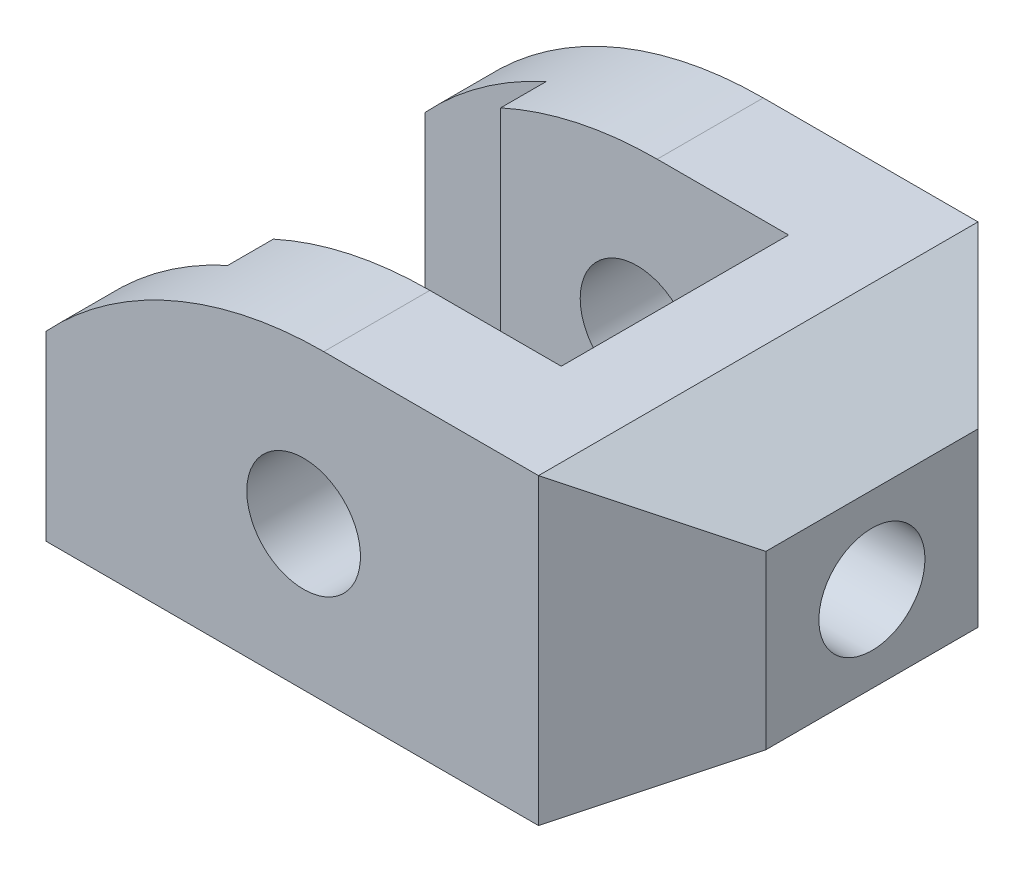
ISO-10303-21;
HEADER;
FILE_DESCRIPTION(('STEP AP214'),'2;1');
FILE_NAME('part.step','',(''),(''),'','','');
FILE_SCHEMA(('AUTOMOTIVE_DESIGN { 1 0 10303 214 1 1 1 1 }'));
ENDSEC;
DATA;
#1=APPLICATION_CONTEXT('core data for automotive mechanical design processes');
#2=APPLICATION_PROTOCOL_DEFINITION('international standard','automotive_design',2000,#1);
#3=PRODUCT_CONTEXT('',#1,'mechanical');
#4=PRODUCT('Part','Part','',(#3));
#5=PRODUCT_RELATED_PRODUCT_CATEGORY('part','',(#4));
#6=PRODUCT_DEFINITION_FORMATION('','',#4);
#7=PRODUCT_DEFINITION_CONTEXT('part definition',#1,'design');
#8=PRODUCT_DEFINITION('design','',#6,#7);
#9=PRODUCT_DEFINITION_SHAPE('','',#8);
#10=(LENGTH_UNIT() NAMED_UNIT(*) SI_UNIT(.MILLI.,.METRE.));
#11=(NAMED_UNIT(*) PLANE_ANGLE_UNIT() SI_UNIT($,.RADIAN.));
#12=(NAMED_UNIT(*) SI_UNIT($,.STERADIAN.) SOLID_ANGLE_UNIT());
#13=UNCERTAINTY_MEASURE_WITH_UNIT(LENGTH_MEASURE(1.E-05),#10,'distance_accuracy_value','');
#14=(GEOMETRIC_REPRESENTATION_CONTEXT(3) GLOBAL_UNCERTAINTY_ASSIGNED_CONTEXT((#13)) GLOBAL_UNIT_ASSIGNED_CONTEXT((#10,
#11,#12)) REPRESENTATION_CONTEXT('',''));
#15=CARTESIAN_POINT('',(0.,0.,0.));
#16=DIRECTION('',(0.,0.,1.));
#17=DIRECTION('',(1.,0.,0.));
#18=AXIS2_PLACEMENT_3D('',#15,#16,#17);
#19=CARTESIAN_POINT('',(36.6606055596467,-10.,29.));
#20=DIRECTION('',(0.,0.,-1.));
#21=DIRECTION('',(-1.,0.,0.));
#22=AXIS2_PLACEMENT_3D('',#19,#20,#21);
#23=PLANE('',#22);
#24=CARTESIAN_POINT('',(34.,19.,29.));
#25=DIRECTION('',(0.,0.,1.));
#26=DIRECTION('',(1.,0.,0.));
#27=AXIS2_PLACEMENT_3D('',#24,#25,#26);
#28=CIRCLE('',#27,7.5);
#29=CARTESIAN_POINT('',(26.5,19.,29.));
#30=VERTEX_POINT('',#29);
#31=EDGE_CURVE('E255',#30,#30,#28,.T.);
#32=ORIENTED_EDGE('',*,*,#31,.F.);
#33=EDGE_LOOP('',(#32));
#34=FACE_BOUND('',#33,.T.);
#35=DIRECTION('',(0.,-1.,0.));
#36=VECTOR('',#35,1.);
#37=CARTESIAN_POINT('',(65.,72.,29.));
#38=LINE('',#37,#36);
#39=CARTESIAN_POINT('',(65.,40.,29.));
#40=VERTEX_POINT('',#39);
#41=CARTESIAN_POINT('',(65.,0.,29.));
#42=VERTEX_POINT('',#41);
#43=EDGE_CURVE('E225',#40,#42,#38,.T.);
#44=ORIENTED_EDGE('',*,*,#43,.F.);
#45=DIRECTION('',(-1.,0.,0.));
#46=VECTOR('',#45,1.);
#47=CARTESIAN_POINT('',(65.,40.,29.));
#48=LINE('',#47,#46);
#49=CARTESIAN_POINT('',(36.6606055596467,40.,29.));
#50=VERTEX_POINT('',#49);
#51=EDGE_CURVE('E232',#40,#50,#48,.T.);
#52=ORIENTED_EDGE('',*,*,#51,.T.);
#53=CARTESIAN_POINT('',(36.6606055596467,-10.,29.));
#54=DIRECTION('',(0.,0.,1.));
#55=DIRECTION('',(-1.,0.,0.));
#56=AXIS2_PLACEMENT_3D('',#53,#54,#55);
#57=CIRCLE('',#56,50.);
#58=CARTESIAN_POINT('',(0.,24.,29.));
#59=VERTEX_POINT('',#58);
#60=EDGE_CURVE('E247',#50,#59,#57,.T.);
#61=ORIENTED_EDGE('',*,*,#60,.T.);
#62=DIRECTION('',(0.,-1.,0.));
#63=VECTOR('',#62,1.);
#64=CARTESIAN_POINT('',(0.,0.,29.));
#65=LINE('',#64,#63);
#66=CARTESIAN_POINT('',(0.,0.,29.));
#67=VERTEX_POINT('',#66);
#68=EDGE_CURVE('E251',#59,#67,#65,.T.);
#69=ORIENTED_EDGE('',*,*,#68,.T.);
#70=DIRECTION('',(1.,0.,0.));
#71=VECTOR('',#70,1.);
#72=CARTESIAN_POINT('',(0.,0.,29.));
#73=LINE('',#72,#71);
#74=EDGE_CURVE('E235',#67,#42,#73,.T.);
#75=ORIENTED_EDGE('',*,*,#74,.T.);
#76=EDGE_LOOP('',(#44,#52,#61,#69,#75));
#77=FACE_BOUND('',#76,.T.);
#78=ADVANCED_FACE('F43',(#34,#77),#23,.F.);
#79=CARTESIAN_POINT('',(36.6606055596467,-10.,-29.));
#80=DIRECTION('',(0.,0.,-1.));
#81=DIRECTION('',(-1.,0.,0.));
#82=AXIS2_PLACEMENT_3D('',#79,#80,#81);
#83=PLANE('',#82);
#84=CARTESIAN_POINT('',(34.,19.,-29.));
#85=DIRECTION('',(0.,0.,1.));
#86=DIRECTION('',(1.,0.,0.));
#87=AXIS2_PLACEMENT_3D('',#84,#85,#86);
#88=CIRCLE('',#87,7.5);
#89=CARTESIAN_POINT('',(26.5,19.,-29.));
#90=VERTEX_POINT('',#89);
#91=EDGE_CURVE('E311',#90,#90,#88,.T.);
#92=ORIENTED_EDGE('',*,*,#91,.T.);
#93=EDGE_LOOP('',(#92));
#94=FACE_BOUND('',#93,.T.);
#95=DIRECTION('',(-1.,0.,0.));
#96=VECTOR('',#95,1.);
#97=CARTESIAN_POINT('',(65.,40.,-29.));
#98=LINE('',#97,#96);
#99=CARTESIAN_POINT('',(65.,40.,-29.));
#100=VERTEX_POINT('',#99);
#101=CARTESIAN_POINT('',(36.6606055596467,40.,-29.));
#102=VERTEX_POINT('',#101);
#103=EDGE_CURVE('E179',#100,#102,#98,.T.);
#104=ORIENTED_EDGE('',*,*,#103,.F.);
#105=DIRECTION('',(0.,-1.,0.));
#106=VECTOR('',#105,1.);
#107=CARTESIAN_POINT('',(65.,72.,-29.));
#108=LINE('',#107,#106);
#109=CARTESIAN_POINT('',(65.,0.,-29.));
#110=VERTEX_POINT('',#109);
#111=EDGE_CURVE('E158',#100,#110,#108,.T.);
#112=ORIENTED_EDGE('',*,*,#111,.T.);
#113=DIRECTION('',(1.,0.,0.));
#114=VECTOR('',#113,1.);
#115=CARTESIAN_POINT('',(0.,0.,-29.));
#116=LINE('',#115,#114);
#117=CARTESIAN_POINT('',(0.,0.,-29.));
#118=VERTEX_POINT('',#117);
#119=EDGE_CURVE('E175',#118,#110,#116,.T.);
#120=ORIENTED_EDGE('',*,*,#119,.F.);
#121=DIRECTION('',(0.,-1.,0.));
#122=VECTOR('',#121,1.);
#123=CARTESIAN_POINT('',(0.,0.,-29.));
#124=LINE('',#123,#122);
#125=CARTESIAN_POINT('',(0.,24.,-29.));
#126=VERTEX_POINT('',#125);
#127=EDGE_CURVE('E189',#126,#118,#124,.T.);
#128=ORIENTED_EDGE('',*,*,#127,.F.);
#129=CARTESIAN_POINT('',(36.6606055596467,-10.,-29.));
#130=DIRECTION('',(0.,0.,1.));
#131=DIRECTION('',(-1.,0.,0.));
#132=AXIS2_PLACEMENT_3D('',#129,#130,#131);
#133=CIRCLE('',#132,50.);
#134=EDGE_CURVE('E258',#102,#126,#133,.T.);
#135=ORIENTED_EDGE('',*,*,#134,.F.);
#136=EDGE_LOOP('',(#104,#112,#120,#128,#135));
#137=FACE_BOUND('',#136,.T.);
#138=ADVANCED_FACE('F173',(#94,#137),#83,.T.);
#139=CARTESIAN_POINT('',(65.,0.,29.));
#140=DIRECTION('',(-0.500000000000001,0.866025403784438,0.));
#141=DIRECTION('',(-0.866025403784438,-0.500000000000001,0.));
#142=AXIS2_PLACEMENT_3D('',#139,#140,#141);
#143=PLANE('',#142);
#144=DIRECTION('',(-0.654653670707976,-0.377964473009228,-0.654653670707978));
#145=VECTOR('',#144,1.);
#146=CARTESIAN_POINT('',(89.8571428571428,14.3512781198564,-4.14285714285708));
#147=LINE('',#146,#145);
#148=CARTESIAN_POINT('',(80.,8.66025403784441,-14.));
#149=VERTEX_POINT('',#148);
#150=EDGE_CURVE('E155',#149,#110,#147,.T.);
#151=ORIENTED_EDGE('',*,*,#150,.F.);
#152=DIRECTION('',(0.,0.,-1.));
#153=VECTOR('',#152,1.);
#154=CARTESIAN_POINT('',(80.,8.66025403784441,29.));
#155=LINE('',#154,#153);
#156=CARTESIAN_POINT('',(80.,8.66025403784441,14.0000000000002));
#157=VERTEX_POINT('',#156);
#158=EDGE_CURVE('E194',#157,#149,#155,.T.);
#159=ORIENTED_EDGE('',*,*,#158,.F.);
#160=DIRECTION('',(0.65465367070798,0.37796447300923,-0.654653670707973));
#161=VECTOR('',#160,1.);
#162=CARTESIAN_POINT('',(65.,0.,29.));
#163=LINE('',#162,#161);
#164=EDGE_CURVE('E167',#42,#157,#163,.T.);
#165=ORIENTED_EDGE('',*,*,#164,.F.);
#166=DIRECTION('',(0.,0.,-1.));
#167=VECTOR('',#166,1.);
#168=CARTESIAN_POINT('',(65.,0.,29.));
#169=LINE('',#168,#167);
#170=EDGE_CURVE('E185',#42,#110,#169,.T.);
#171=ORIENTED_EDGE('',*,*,#170,.T.);
#172=EDGE_LOOP('',(#151,#159,#165,#171));
#173=FACE_BOUND('',#172,.T.);
#174=ADVANCED_FACE('F192',(#173),#143,.F.);
#175=CARTESIAN_POINT('',(80.,8.66025403784441,29.));
#176=DIRECTION('',(-1.,0.,0.));
#177=DIRECTION('',(0.,0.,1.));
#178=AXIS2_PLACEMENT_3D('',#175,#176,#177);
#179=PLANE('',#178);
#180=CARTESIAN_POINT('',(80.,20.,0.));
#181=DIRECTION('',(1.,0.,0.));
#182=DIRECTION('',(0.,0.,-1.));
#183=AXIS2_PLACEMENT_3D('',#180,#181,#182);
#184=CIRCLE('',#183,7.);
#185=CARTESIAN_POINT('',(80.,20.,-7.));
#186=VERTEX_POINT('',#185);
#187=EDGE_CURVE('E270',#186,#186,#184,.T.);
#188=ORIENTED_EDGE('',*,*,#187,.F.);
#189=EDGE_LOOP('',(#188));
#190=FACE_BOUND('',#189,.T.);
#191=DIRECTION('',(0.,-1.,0.));
#192=VECTOR('',#191,1.);
#193=CARTESIAN_POINT('',(80.,72.,-14.));
#194=LINE('',#193,#192);
#195=CARTESIAN_POINT('',(80.,31.3397459621557,-14.));
#196=VERTEX_POINT('',#195);
#197=EDGE_CURVE('E161',#196,#149,#194,.T.);
#198=ORIENTED_EDGE('',*,*,#197,.F.);
#199=DIRECTION('',(0.,0.,-1.));
#200=VECTOR('',#199,1.);
#201=CARTESIAN_POINT('',(80.,31.3397459621557,29.));
#202=LINE('',#201,#200);
#203=CARTESIAN_POINT('',(80.,31.3397459621557,14.0000000000002));
#204=VERTEX_POINT('',#203);
#205=EDGE_CURVE('E198',#204,#196,#202,.T.);
#206=ORIENTED_EDGE('',*,*,#205,.F.);
#207=DIRECTION('',(0.,-1.,0.));
#208=VECTOR('',#207,1.);
#209=CARTESIAN_POINT('',(80.,72.,14.0000000000002));
#210=LINE('',#209,#208);
#211=EDGE_CURVE('E59',#204,#157,#210,.T.);
#212=ORIENTED_EDGE('',*,*,#211,.T.);
#213=ORIENTED_EDGE('',*,*,#158,.T.);
#214=EDGE_LOOP('',(#198,#206,#212,#213));
#215=FACE_BOUND('',#214,.T.);
#216=ADVANCED_FACE('F266',(#190,#215),#179,.F.);
#217=CARTESIAN_POINT('',(80.,31.3397459621557,29.));
#218=DIRECTION('',(-0.499999999999995,-0.866025403784441,0.));
#219=DIRECTION('',(0.866025403784442,-0.499999999999995,0.));
#220=AXIS2_PLACEMENT_3D('',#217,#218,#219);
#221=PLANE('',#220);
#222=DIRECTION('',(0.654653670707978,-0.377964473009222,0.65465367070798));
#223=VECTOR('',#222,1.);
#224=CARTESIAN_POINT('',(98.4285714285715,20.7000052870899,4.42857142857159));
#225=LINE('',#224,#223);
#226=EDGE_CURVE('E11',#100,#196,#225,.T.);
#227=ORIENTED_EDGE('',*,*,#226,.F.);
#228=DIRECTION('',(0.,0.,-1.));
#229=VECTOR('',#228,1.);
#230=CARTESIAN_POINT('',(65.,40.,29.));
#231=LINE('',#230,#229);
#232=EDGE_CURVE('E238',#40,#100,#231,.T.);
#233=ORIENTED_EDGE('',*,*,#232,.F.);
#234=DIRECTION('',(-0.654653670707981,0.377964473009225,0.654653670707975));
#235=VECTOR('',#234,1.);
#236=CARTESIAN_POINT('',(73.5714285714286,35.0512834069461,20.4285714285715));
#237=LINE('',#236,#235);
#238=EDGE_CURVE('E52',#204,#40,#237,.T.);
#239=ORIENTED_EDGE('',*,*,#238,.F.);
#240=ORIENTED_EDGE('',*,*,#205,.T.);
#241=EDGE_LOOP('',(#227,#233,#239,#240));
#242=FACE_BOUND('',#241,.T.);
#243=ADVANCED_FACE('F239',(#242),#221,.F.);
#244=CARTESIAN_POINT('',(0.,0.,29.));
#245=DIRECTION('',(1.,0.,0.));
#246=DIRECTION('',(0.,0.,-1.));
#247=AXIS2_PLACEMENT_3D('',#244,#245,#246);
#248=PLANE('',#247);
#249=DIRECTION('',(0.,-1.,0.));
#250=VECTOR('',#249,1.);
#251=CARTESIAN_POINT('',(0.,72.,21.));
#252=LINE('',#251,#250);
#253=CARTESIAN_POINT('',(0.,24.,21.));
#254=VERTEX_POINT('',#253);
#255=CARTESIAN_POINT('',(0.,0.,21.));
#256=VERTEX_POINT('',#255);
#257=EDGE_CURVE('E208',#254,#256,#252,.T.);
#258=ORIENTED_EDGE('',*,*,#257,.T.);
#259=DIRECTION('',(0.,0.,-1.));
#260=VECTOR('',#259,1.);
#261=CARTESIAN_POINT('',(0.,0.,29.));
#262=LINE('',#261,#260);
#263=EDGE_CURVE('E196',#67,#256,#262,.T.);
#264=ORIENTED_EDGE('',*,*,#263,.F.);
#265=ORIENTED_EDGE('',*,*,#68,.F.);
#266=DIRECTION('',(0.,0.,-1.));
#267=VECTOR('',#266,1.);
#268=CARTESIAN_POINT('',(0.,24.,29.));
#269=LINE('',#268,#267);
#270=EDGE_CURVE('E261',#59,#254,#269,.T.);
#271=ORIENTED_EDGE('',*,*,#270,.T.);
#272=EDGE_LOOP('',(#258,#264,#265,#271));
#273=FACE_BOUND('',#272,.T.);
#274=ADVANCED_FACE('F45',(#273),#248,.F.);
#275=DIRECTION('',(0.,-1.,0.));
#276=VECTOR('',#275,1.);
#277=CARTESIAN_POINT('',(0.,72.,-21.));
#278=LINE('',#277,#276);
#279=CARTESIAN_POINT('',(0.,24.,-21.));
#280=VERTEX_POINT('',#279);
#281=CARTESIAN_POINT('',(0.,0.,-21.));
#282=VERTEX_POINT('',#281);
#283=EDGE_CURVE('E291',#280,#282,#278,.T.);
#284=ORIENTED_EDGE('',*,*,#283,.F.);
#285=EDGE_CURVE('E249',#280,#126,#269,.T.);
#286=ORIENTED_EDGE('',*,*,#285,.T.);
#287=ORIENTED_EDGE('',*,*,#127,.T.);
#288=EDGE_CURVE('E188',#282,#118,#262,.T.);
#289=ORIENTED_EDGE('',*,*,#288,.F.);
#290=EDGE_LOOP('',(#284,#286,#287,#289));
#291=FACE_BOUND('',#290,.T.);
#292=ADVANCED_FACE('F350',(#291),#248,.F.);
#293=CARTESIAN_POINT('',(0.,0.,29.));
#294=DIRECTION('',(0.,1.,0.));
#295=DIRECTION('',(0.,0.,1.));
#296=AXIS2_PLACEMENT_3D('',#293,#294,#295);
#297=PLANE('',#296);
#298=DIRECTION('',(1.,0.,0.));
#299=VECTOR('',#298,1.);
#300=CARTESIAN_POINT('',(0.,0.,21.));
#301=LINE('',#300,#299);
#302=CARTESIAN_POINT('',(16.,0.,21.));
#303=VERTEX_POINT('',#302);
#304=EDGE_CURVE('E166',#256,#303,#301,.T.);
#305=ORIENTED_EDGE('',*,*,#304,.T.);
#306=DIRECTION('',(0.,0.,-1.));
#307=VECTOR('',#306,1.);
#308=CARTESIAN_POINT('',(16.,0.,15.));
#309=LINE('',#308,#307);
#310=CARTESIAN_POINT('',(16.,0.,15.));
#311=VERTEX_POINT('',#310);
#312=EDGE_CURVE('E274',#303,#311,#309,.T.);
#313=ORIENTED_EDGE('',*,*,#312,.T.);
#314=DIRECTION('',(1.,0.,0.));
#315=VECTOR('',#314,1.);
#316=CARTESIAN_POINT('',(16.,0.,15.));
#317=LINE('',#316,#315);
#318=CARTESIAN_POINT('',(54.,0.,15.));
#319=VERTEX_POINT('',#318);
#320=EDGE_CURVE('E277',#311,#319,#317,.T.);
#321=ORIENTED_EDGE('',*,*,#320,.T.);
#322=DIRECTION('',(0.,0.,-1.));
#323=VECTOR('',#322,1.);
#324=CARTESIAN_POINT('',(54.,0.,15.));
#325=LINE('',#324,#323);
#326=CARTESIAN_POINT('',(54.,0.,-15.));
#327=VERTEX_POINT('',#326);
#328=EDGE_CURVE('E280',#319,#327,#325,.T.);
#329=ORIENTED_EDGE('',*,*,#328,.T.);
#330=DIRECTION('',(-1.,0.,0.));
#331=VECTOR('',#330,1.);
#332=CARTESIAN_POINT('',(16.,0.,-15.));
#333=LINE('',#332,#331);
#334=CARTESIAN_POINT('',(16.,0.,-15.));
#335=VERTEX_POINT('',#334);
#336=EDGE_CURVE('E283',#327,#335,#333,.T.);
#337=ORIENTED_EDGE('',*,*,#336,.T.);
#338=DIRECTION('',(0.,0.,-1.));
#339=VECTOR('',#338,1.);
#340=CARTESIAN_POINT('',(16.,0.,-21.));
#341=LINE('',#340,#339);
#342=CARTESIAN_POINT('',(16.,0.,-21.));
#343=VERTEX_POINT('',#342);
#344=EDGE_CURVE('E286',#335,#343,#341,.T.);
#345=ORIENTED_EDGE('',*,*,#344,.T.);
#346=DIRECTION('',(-1.,0.,0.));
#347=VECTOR('',#346,1.);
#348=CARTESIAN_POINT('',(0.,0.,-21.));
#349=LINE('',#348,#347);
#350=EDGE_CURVE('E289',#343,#282,#349,.T.);
#351=ORIENTED_EDGE('',*,*,#350,.T.);
#352=ORIENTED_EDGE('',*,*,#288,.T.);
#353=ORIENTED_EDGE('',*,*,#119,.T.);
#354=ORIENTED_EDGE('',*,*,#170,.F.);
#355=ORIENTED_EDGE('',*,*,#74,.F.);
#356=ORIENTED_EDGE('',*,*,#263,.T.);
#357=EDGE_LOOP('',(#305,#313,#321,#329,#337,#345,#351,#352,#353,#354,#355,#356));
#358=FACE_BOUND('',#357,.T.);
#359=ADVANCED_FACE('F184',(#358),#297,.F.);
#360=CARTESIAN_POINT('',(65.,40.,29.));
#361=DIRECTION('',(0.,-1.,0.));
#362=DIRECTION('',(1.,0.,0.));
#363=AXIS2_PLACEMENT_3D('',#360,#361,#362);
#364=PLANE('',#363);
#365=DIRECTION('',(1.,0.,0.));
#366=VECTOR('',#365,1.);
#367=CARTESIAN_POINT('',(65.,40.,15.));
#368=LINE('',#367,#366);
#369=CARTESIAN_POINT('',(36.6606055596467,40.,15.));
#370=VERTEX_POINT('',#369);
#371=CARTESIAN_POINT('',(54.,40.,15.));
#372=VERTEX_POINT('',#371);
#373=EDGE_CURVE('E309',#370,#372,#368,.T.);
#374=ORIENTED_EDGE('',*,*,#373,.F.);
#375=DIRECTION('',(0.,0.,-1.));
#376=VECTOR('',#375,1.);
#377=CARTESIAN_POINT('',(36.6606055596467,40.,29.));
#378=LINE('',#377,#376);
#379=EDGE_CURVE('E241',#50,#370,#378,.T.);
#380=ORIENTED_EDGE('',*,*,#379,.F.);
#381=ORIENTED_EDGE('',*,*,#51,.F.);
#382=ORIENTED_EDGE('',*,*,#232,.T.);
#383=ORIENTED_EDGE('',*,*,#103,.T.);
#384=CARTESIAN_POINT('',(36.6606055596467,40.,-15.));
#385=VERTEX_POINT('',#384);
#386=EDGE_CURVE('E264',#385,#102,#378,.T.);
#387=ORIENTED_EDGE('',*,*,#386,.F.);
#388=DIRECTION('',(-1.,0.,0.));
#389=VECTOR('',#388,1.);
#390=CARTESIAN_POINT('',(65.,40.,-15.));
#391=LINE('',#390,#389);
#392=CARTESIAN_POINT('',(54.,40.,-15.));
#393=VERTEX_POINT('',#392);
#394=EDGE_CURVE('E213',#393,#385,#391,.T.);
#395=ORIENTED_EDGE('',*,*,#394,.F.);
#396=DIRECTION('',(0.,0.,-1.));
#397=VECTOR('',#396,1.);
#398=CARTESIAN_POINT('',(54.,40.,29.));
#399=LINE('',#398,#397);
#400=EDGE_CURVE('E221',#372,#393,#399,.T.);
#401=ORIENTED_EDGE('',*,*,#400,.F.);
#402=EDGE_LOOP('',(#374,#380,#381,#382,#383,#387,#395,#401));
#403=FACE_BOUND('',#402,.T.);
#404=ADVANCED_FACE('F244',(#403),#364,.F.);
#405=CARTESIAN_POINT('',(36.6606055596467,-10.,29.));
#406=DIRECTION('',(0.,0.,-1.));
#407=DIRECTION('',(-1.,0.,0.));
#408=AXIS2_PLACEMENT_3D('',#405,#406,#407);
#409=CYLINDRICAL_SURFACE('',#408,50.);
#410=CARTESIAN_POINT('',(36.6606055596467,-10.,21.));
#411=DIRECTION('',(0.,0.,-1.));
#412=DIRECTION('',(-1.,0.,0.));
#413=AXIS2_PLACEMENT_3D('',#410,#411,#412);
#414=CIRCLE('',#413,50.);
#415=CARTESIAN_POINT('',(16.,35.5317403347236,21.));
#416=VERTEX_POINT('',#415);
#417=EDGE_CURVE('E219',#254,#416,#414,.T.);
#418=ORIENTED_EDGE('',*,*,#417,.F.);
#419=ORIENTED_EDGE('',*,*,#270,.F.);
#420=ORIENTED_EDGE('',*,*,#60,.F.);
#421=ORIENTED_EDGE('',*,*,#379,.T.);
#422=CARTESIAN_POINT('',(36.6606055596467,-10.,15.));
#423=DIRECTION('',(0.,0.,-1.));
#424=DIRECTION('',(-1.,0.,0.));
#425=AXIS2_PLACEMENT_3D('',#422,#423,#424);
#426=CIRCLE('',#425,50.);
#427=CARTESIAN_POINT('',(16.,35.5317403347236,15.));
#428=VERTEX_POINT('',#427);
#429=EDGE_CURVE('E212',#428,#370,#426,.T.);
#430=ORIENTED_EDGE('',*,*,#429,.F.);
#431=DIRECTION('',(0.,0.,-1.));
#432=VECTOR('',#431,1.);
#433=CARTESIAN_POINT('',(16.,35.5317403347236,29.));
#434=LINE('',#433,#432);
#435=EDGE_CURVE('E217',#416,#428,#434,.T.);
#436=ORIENTED_EDGE('',*,*,#435,.F.);
#437=EDGE_LOOP('',(#418,#419,#420,#421,#430,#436));
#438=FACE_BOUND('',#437,.T.);
#439=ADVANCED_FACE('F357',(#438),#409,.T.);
#440=CARTESIAN_POINT('',(36.6606055596467,-10.,-15.));
#441=DIRECTION('',(0.,0.,1.));
#442=DIRECTION('',(1.,0.,0.));
#443=AXIS2_PLACEMENT_3D('',#440,#441,#442);
#444=CIRCLE('',#443,50.);
#445=CARTESIAN_POINT('',(16.,35.5317403347236,-15.));
#446=VERTEX_POINT('',#445);
#447=EDGE_CURVE('E207',#385,#446,#444,.T.);
#448=ORIENTED_EDGE('',*,*,#447,.F.);
#449=ORIENTED_EDGE('',*,*,#386,.T.);
#450=ORIENTED_EDGE('',*,*,#134,.T.);
#451=ORIENTED_EDGE('',*,*,#285,.F.);
#452=CARTESIAN_POINT('',(36.6606055596467,-10.,-21.));
#453=DIRECTION('',(0.,0.,1.));
#454=DIRECTION('',(1.,0.,0.));
#455=AXIS2_PLACEMENT_3D('',#452,#453,#454);
#456=CIRCLE('',#455,50.);
#457=CARTESIAN_POINT('',(16.,35.5317403347236,-21.));
#458=VERTEX_POINT('',#457);
#459=EDGE_CURVE('E203',#458,#280,#456,.T.);
#460=ORIENTED_EDGE('',*,*,#459,.F.);
#461=DIRECTION('',(0.,0.,-1.));
#462=VECTOR('',#461,1.);
#463=CARTESIAN_POINT('',(16.,35.5317403347236,29.));
#464=LINE('',#463,#462);
#465=EDGE_CURVE('E215',#446,#458,#464,.T.);
#466=ORIENTED_EDGE('',*,*,#465,.F.);
#467=EDGE_LOOP('',(#448,#449,#450,#451,#460,#466));
#468=FACE_BOUND('',#467,.T.);
#469=ADVANCED_FACE('F353',(#468),#409,.T.);
#470=CARTESIAN_POINT('',(34.,19.,29.));
#471=DIRECTION('',(0.,0.,-1.));
#472=DIRECTION('',(-1.,0.,0.));
#473=AXIS2_PLACEMENT_3D('',#470,#471,#472);
#474=CYLINDRICAL_SURFACE('',#473,7.5);
#475=CARTESIAN_POINT('',(34.,19.,15.));
#476=DIRECTION('',(0.,0.,-1.));
#477=DIRECTION('',(-1.,0.,0.));
#478=AXIS2_PLACEMENT_3D('',#475,#476,#477);
#479=CIRCLE('',#478,7.5);
#480=CARTESIAN_POINT('',(26.5,19.,15.));
#481=VERTEX_POINT('',#480);
#482=EDGE_CURVE('E209',#481,#481,#479,.T.);
#483=CARTESIAN_POINT('',(26.5,19.,29.));
#484=CARTESIAN_POINT('',(26.5,19.,28.8541666666667));
#485=CARTESIAN_POINT('',(26.5,19.,28.7083333333333));
#486=CARTESIAN_POINT('',(26.5,19.,28.4166666666667));
#487=CARTESIAN_POINT('',(26.5,19.,28.2708333333333));
#488=CARTESIAN_POINT('',(26.5,19.,27.9791666666667));
#489=CARTESIAN_POINT('',(26.5,19.,27.8333333333333));
#490=CARTESIAN_POINT('',(26.5,19.,27.5416666666667));
#491=CARTESIAN_POINT('',(26.5,19.,27.3958333333333));
#492=CARTESIAN_POINT('',(26.5,19.,27.1041666666667));
#493=CARTESIAN_POINT('',(26.5,19.,26.9583333333333));
#494=CARTESIAN_POINT('',(26.5,19.,26.6666666666667));
#495=CARTESIAN_POINT('',(26.5,19.,26.5208333333333));
#496=CARTESIAN_POINT('',(26.5,19.,26.2291666666667));
#497=CARTESIAN_POINT('',(26.5,19.,26.0833333333333));
#498=CARTESIAN_POINT('',(26.5,19.,25.7916666666667));
#499=CARTESIAN_POINT('',(26.5,19.,25.6458333333333));
#500=CARTESIAN_POINT('',(26.5,19.,25.3541666666667));
#501=CARTESIAN_POINT('',(26.5,19.,25.2083333333333));
#502=CARTESIAN_POINT('',(26.5,19.,24.9166666666667));
#503=CARTESIAN_POINT('',(26.5,19.,24.7708333333333));
#504=CARTESIAN_POINT('',(26.5,19.,24.4791666666667));
#505=CARTESIAN_POINT('',(26.5,19.,24.3333333333333));
#506=CARTESIAN_POINT('',(26.5,19.,24.0416666666667));
#507=CARTESIAN_POINT('',(26.5,19.,23.8958333333333));
#508=CARTESIAN_POINT('',(26.5,19.,23.6041666666667));
#509=CARTESIAN_POINT('',(26.5,19.,23.4583333333333));
#510=CARTESIAN_POINT('',(26.5,19.,23.1666666666667));
#511=CARTESIAN_POINT('',(26.5,19.,23.0208333333333));
#512=CARTESIAN_POINT('',(26.5,19.,22.7291666666667));
#513=CARTESIAN_POINT('',(26.5,19.,22.5833333333333));
#514=CARTESIAN_POINT('',(26.5,19.,22.2916666666667));
#515=CARTESIAN_POINT('',(26.5,19.,22.1458333333333));
#516=CARTESIAN_POINT('',(26.5,19.,21.8541666666667));
#517=CARTESIAN_POINT('',(26.5,19.,21.7083333333333));
#518=CARTESIAN_POINT('',(26.5,19.,21.4166666666667));
#519=CARTESIAN_POINT('',(26.5,19.,21.2708333333333));
#520=CARTESIAN_POINT('',(26.5,19.,20.9791666666667));
#521=CARTESIAN_POINT('',(26.5,19.,20.8333333333333));
#522=CARTESIAN_POINT('',(26.5,19.,20.5416666666667));
#523=CARTESIAN_POINT('',(26.5,19.,20.3958333333333));
#524=CARTESIAN_POINT('',(26.5,19.,20.1041666666667));
#525=CARTESIAN_POINT('',(26.5,19.,19.9583333333333));
#526=CARTESIAN_POINT('',(26.5,19.,19.6666666666667));
#527=CARTESIAN_POINT('',(26.5,19.,19.5208333333333));
#528=CARTESIAN_POINT('',(26.5,19.,19.2291666666667));
#529=CARTESIAN_POINT('',(26.5,19.,19.0833333333333));
#530=CARTESIAN_POINT('',(26.5,19.,18.7916666666667));
#531=CARTESIAN_POINT('',(26.5,19.,18.6458333333333));
#532=CARTESIAN_POINT('',(26.5,19.,18.3541666666667));
#533=CARTESIAN_POINT('',(26.5,19.,18.2083333333333));
#534=CARTESIAN_POINT('',(26.5,19.,17.9166666666667));
#535=CARTESIAN_POINT('',(26.5,19.,17.7708333333333));
#536=CARTESIAN_POINT('',(26.5,19.,17.4791666666667));
#537=CARTESIAN_POINT('',(26.5,19.,17.3333333333333));
#538=CARTESIAN_POINT('',(26.5,19.,17.0416666666667));
#539=CARTESIAN_POINT('',(26.5,19.,16.8958333333333));
#540=CARTESIAN_POINT('',(26.5,19.,16.6041666666667));
#541=CARTESIAN_POINT('',(26.5,19.,16.4583333333333));
#542=CARTESIAN_POINT('',(26.5,19.,16.1666666666667));
#543=CARTESIAN_POINT('',(26.5,19.,16.0208333333333));
#544=CARTESIAN_POINT('',(26.5,19.,15.7291666666667));
#545=CARTESIAN_POINT('',(26.5,19.,15.5833333333333));
#546=CARTESIAN_POINT('',(26.5,19.,15.2916666666667));
#547=CARTESIAN_POINT('',(26.5,19.,15.1458333333333));
#548=CARTESIAN_POINT('',(26.5,19.,15.));
#549=B_SPLINE_CURVE_WITH_KNOTS('',3,(#483,#484,#485,#486,#487,#488,#489,#490,#491,#492,#493,
#494,#495,#496,#497,#498,#499,#500,#501,#502,#503,#504,#505,#506,#507,#508,#509,#510,#511,#512,
#513,#514,#515,#516,#517,#518,#519,#520,#521,#522,#523,#524,#525,#526,#527,#528,#529,#530,#531,
#532,#533,#534,#535,#536,#537,#538,#539,#540,#541,#542,#543,#544,#545,#546,#547,#548),
.UNSPECIFIED.,.F.,.F.,(4,2,2,2,2,2,2,2,2,2,2,2,2,2,2,2,2,2,2,2,2,2,2,2,2,2,2,2,2,2,2,2,4),(0.,
0.4375,0.875000000000001,1.3125,1.75,2.1875,2.625,3.0625,3.5,3.9375,4.375,4.8125,5.25,5.6875,
6.125,6.5625,7.,7.4375,7.875,8.3125,8.75,9.1875,9.625,10.0625,10.5,10.9375,11.375,11.8125,12.25,
12.6875,13.125,13.5625,14.),.UNSPECIFIED.);
#550=EDGE_CURVE('BSEAM364',#30,#481,#549,.T.);
#551=ORIENTED_EDGE('',*,*,#31,.T.);
#552=ORIENTED_EDGE('',*,*,#482,.T.);
#553=ORIENTED_EDGE('',*,*,#550,.T.);
#554=ORIENTED_EDGE('',*,*,#550,.F.);
#555=EDGE_LOOP('',(#551,#553,#552,#554));
#556=FACE_BOUND('',#555,.T.);
#557=ADVANCED_FACE('F364',(#556),#474,.F.);
#558=CARTESIAN_POINT('',(34.,19.,-15.));
#559=DIRECTION('',(0.,0.,1.));
#560=DIRECTION('',(1.,0.,0.));
#561=AXIS2_PLACEMENT_3D('',#558,#559,#560);
#562=CIRCLE('',#561,7.5);
#563=CARTESIAN_POINT('',(26.5,19.,-15.));
#564=VERTEX_POINT('',#563);
#565=EDGE_CURVE('E204',#564,#564,#562,.T.);
#566=CARTESIAN_POINT('',(26.5,19.,-29.));
#567=CARTESIAN_POINT('',(26.5,19.,-28.8541666666667));
#568=CARTESIAN_POINT('',(26.5,19.,-28.7083333333333));
#569=CARTESIAN_POINT('',(26.5,19.,-28.4166666666667));
#570=CARTESIAN_POINT('',(26.5,19.,-28.2708333333333));
#571=CARTESIAN_POINT('',(26.5,19.,-27.9791666666667));
#572=CARTESIAN_POINT('',(26.5,19.,-27.8333333333333));
#573=CARTESIAN_POINT('',(26.5,19.,-27.5416666666667));
#574=CARTESIAN_POINT('',(26.5,19.,-27.3958333333333));
#575=CARTESIAN_POINT('',(26.5,19.,-27.1041666666667));
#576=CARTESIAN_POINT('',(26.5,19.,-26.9583333333333));
#577=CARTESIAN_POINT('',(26.5,19.,-26.6666666666667));
#578=CARTESIAN_POINT('',(26.5,19.,-26.5208333333333));
#579=CARTESIAN_POINT('',(26.5,19.,-26.2291666666667));
#580=CARTESIAN_POINT('',(26.5,19.,-26.0833333333333));
#581=CARTESIAN_POINT('',(26.5,19.,-25.7916666666667));
#582=CARTESIAN_POINT('',(26.5,19.,-25.6458333333333));
#583=CARTESIAN_POINT('',(26.5,19.,-25.3541666666667));
#584=CARTESIAN_POINT('',(26.5,19.,-25.2083333333333));
#585=CARTESIAN_POINT('',(26.5,19.,-24.9166666666667));
#586=CARTESIAN_POINT('',(26.5,19.,-24.7708333333333));
#587=CARTESIAN_POINT('',(26.5,19.,-24.4791666666667));
#588=CARTESIAN_POINT('',(26.5,19.,-24.3333333333333));
#589=CARTESIAN_POINT('',(26.5,19.,-24.0416666666667));
#590=CARTESIAN_POINT('',(26.5,19.,-23.8958333333333));
#591=CARTESIAN_POINT('',(26.5,19.,-23.6041666666667));
#592=CARTESIAN_POINT('',(26.5,19.,-23.4583333333333));
#593=CARTESIAN_POINT('',(26.5,19.,-23.1666666666667));
#594=CARTESIAN_POINT('',(26.5,19.,-23.0208333333333));
#595=CARTESIAN_POINT('',(26.5,19.,-22.7291666666667));
#596=CARTESIAN_POINT('',(26.5,19.,-22.5833333333333));
#597=CARTESIAN_POINT('',(26.5,19.,-22.2916666666667));
#598=CARTESIAN_POINT('',(26.5,19.,-22.1458333333333));
#599=CARTESIAN_POINT('',(26.5,19.,-21.8541666666667));
#600=CARTESIAN_POINT('',(26.5,19.,-21.7083333333333));
#601=CARTESIAN_POINT('',(26.5,19.,-21.4166666666667));
#602=CARTESIAN_POINT('',(26.5,19.,-21.2708333333333));
#603=CARTESIAN_POINT('',(26.5,19.,-20.9791666666667));
#604=CARTESIAN_POINT('',(26.5,19.,-20.8333333333333));
#605=CARTESIAN_POINT('',(26.5,19.,-20.5416666666667));
#606=CARTESIAN_POINT('',(26.5,19.,-20.3958333333333));
#607=CARTESIAN_POINT('',(26.5,19.,-20.1041666666667));
#608=CARTESIAN_POINT('',(26.5,19.,-19.9583333333333));
#609=CARTESIAN_POINT('',(26.5,19.,-19.6666666666667));
#610=CARTESIAN_POINT('',(26.5,19.,-19.5208333333333));
#611=CARTESIAN_POINT('',(26.5,19.,-19.2291666666667));
#612=CARTESIAN_POINT('',(26.5,19.,-19.0833333333333));
#613=CARTESIAN_POINT('',(26.5,19.,-18.7916666666667));
#614=CARTESIAN_POINT('',(26.5,19.,-18.6458333333333));
#615=CARTESIAN_POINT('',(26.5,19.,-18.3541666666667));
#616=CARTESIAN_POINT('',(26.5,19.,-18.2083333333333));
#617=CARTESIAN_POINT('',(26.5,19.,-17.9166666666667));
#618=CARTESIAN_POINT('',(26.5,19.,-17.7708333333333));
#619=CARTESIAN_POINT('',(26.5,19.,-17.4791666666667));
#620=CARTESIAN_POINT('',(26.5,19.,-17.3333333333333));
#621=CARTESIAN_POINT('',(26.5,19.,-17.0416666666667));
#622=CARTESIAN_POINT('',(26.5,19.,-16.8958333333333));
#623=CARTESIAN_POINT('',(26.5,19.,-16.6041666666667));
#624=CARTESIAN_POINT('',(26.5,19.,-16.4583333333333));
#625=CARTESIAN_POINT('',(26.5,19.,-16.1666666666667));
#626=CARTESIAN_POINT('',(26.5,19.,-16.0208333333333));
#627=CARTESIAN_POINT('',(26.5,19.,-15.7291666666667));
#628=CARTESIAN_POINT('',(26.5,19.,-15.5833333333333));
#629=CARTESIAN_POINT('',(26.5,19.,-15.2916666666667));
#630=CARTESIAN_POINT('',(26.5,19.,-15.1458333333333));
#631=CARTESIAN_POINT('',(26.5,19.,-15.));
#632=B_SPLINE_CURVE_WITH_KNOTS('',3,(#566,#567,#568,#569,#570,#571,#572,#573,#574,#575,#576,
#577,#578,#579,#580,#581,#582,#583,#584,#585,#586,#587,#588,#589,#590,#591,#592,#593,#594,#595,
#596,#597,#598,#599,#600,#601,#602,#603,#604,#605,#606,#607,#608,#609,#610,#611,#612,#613,#614,
#615,#616,#617,#618,#619,#620,#621,#622,#623,#624,#625,#626,#627,#628,#629,#630,#631),
.UNSPECIFIED.,.F.,.F.,(4,2,2,2,2,2,2,2,2,2,2,2,2,2,2,2,2,2,2,2,2,2,2,2,2,2,2,2,2,2,2,2,4),(0.,
0.4375,0.875000000000001,1.3125,1.75,2.1875,2.625,3.0625,3.5,3.9375,4.375,4.8125,5.25,5.6875,
6.125,6.5625,7.,7.4375,7.875,8.3125,8.75,9.1875,9.62499999999999,10.0625,10.5,10.9375,11.375,
11.8125,12.25,12.6875,13.125,13.5625,14.),.UNSPECIFIED.);
#633=EDGE_CURVE('BSEAM380',#90,#564,#632,.T.);
#634=ORIENTED_EDGE('',*,*,#91,.F.);
#635=ORIENTED_EDGE('',*,*,#565,.T.);
#636=ORIENTED_EDGE('',*,*,#633,.T.);
#637=ORIENTED_EDGE('',*,*,#633,.F.);
#638=EDGE_LOOP('',(#634,#636,#635,#637));
#639=FACE_BOUND('',#638,.T.);
#640=ADVANCED_FACE('F380',(#639),#474,.F.);
#641=CARTESIAN_POINT('',(54.,72.,15.));
#642=DIRECTION('',(-1.,0.,0.));
#643=DIRECTION('',(0.,0.,1.));
#644=AXIS2_PLACEMENT_3D('',#641,#642,#643);
#645=PLANE('',#644);
#646=CARTESIAN_POINT('',(54.,20.,0.));
#647=DIRECTION('',(-1.,0.,0.));
#648=DIRECTION('',(0.,0.,1.));
#649=AXIS2_PLACEMENT_3D('',#646,#647,#648);
#650=CIRCLE('',#649,7.);
#651=CARTESIAN_POINT('',(54.,20.,7.));
#652=VERTEX_POINT('',#651);
#653=EDGE_CURVE('E47',#652,#652,#650,.T.);
#654=ORIENTED_EDGE('',*,*,#653,.F.);
#655=EDGE_LOOP('',(#654));
#656=FACE_BOUND('',#655,.T.);
#657=ORIENTED_EDGE('',*,*,#400,.T.);
#658=DIRECTION('',(0.,-1.,0.));
#659=VECTOR('',#658,1.);
#660=CARTESIAN_POINT('',(54.,72.,-15.));
#661=LINE('',#660,#659);
#662=EDGE_CURVE('E296',#393,#327,#661,.T.);
#663=ORIENTED_EDGE('',*,*,#662,.T.);
#664=ORIENTED_EDGE('',*,*,#328,.F.);
#665=DIRECTION('',(0.,-1.,0.));
#666=VECTOR('',#665,1.);
#667=CARTESIAN_POINT('',(54.,72.,15.));
#668=LINE('',#667,#666);
#669=EDGE_CURVE('E298',#372,#319,#668,.T.);
#670=ORIENTED_EDGE('',*,*,#669,.F.);
#671=EDGE_LOOP('',(#657,#663,#664,#670));
#672=FACE_BOUND('',#671,.T.);
#673=ADVANCED_FACE('F336',(#656,#672),#645,.T.);
#674=CARTESIAN_POINT('',(0.,72.,21.));
#675=DIRECTION('',(0.,0.,-1.));
#676=DIRECTION('',(-1.,0.,0.));
#677=AXIS2_PLACEMENT_3D('',#674,#675,#676);
#678=PLANE('',#677);
#679=ORIENTED_EDGE('',*,*,#417,.T.);
#680=DIRECTION('',(0.,-1.,0.));
#681=VECTOR('',#680,1.);
#682=CARTESIAN_POINT('',(16.,72.,21.));
#683=LINE('',#682,#681);
#684=EDGE_CURVE('E302',#416,#303,#683,.T.);
#685=ORIENTED_EDGE('',*,*,#684,.T.);
#686=ORIENTED_EDGE('',*,*,#304,.F.);
#687=ORIENTED_EDGE('',*,*,#257,.F.);
#688=EDGE_LOOP('',(#679,#685,#686,#687));
#689=FACE_BOUND('',#688,.T.);
#690=ADVANCED_FACE('F321',(#689),#678,.T.);
#691=CARTESIAN_POINT('',(16.,72.,15.));
#692=DIRECTION('',(-1.,0.,0.));
#693=DIRECTION('',(0.,0.,1.));
#694=AXIS2_PLACEMENT_3D('',#691,#692,#693);
#695=PLANE('',#694);
#696=ORIENTED_EDGE('',*,*,#435,.T.);
#697=DIRECTION('',(0.,-1.,0.));
#698=VECTOR('',#697,1.);
#699=CARTESIAN_POINT('',(16.,72.,15.));
#700=LINE('',#699,#698);
#701=EDGE_CURVE('E300',#428,#311,#700,.T.);
#702=ORIENTED_EDGE('',*,*,#701,.T.);
#703=ORIENTED_EDGE('',*,*,#312,.F.);
#704=ORIENTED_EDGE('',*,*,#684,.F.);
#705=EDGE_LOOP('',(#696,#702,#703,#704));
#706=FACE_BOUND('',#705,.T.);
#707=ADVANCED_FACE('F326',(#706),#695,.T.);
#708=CARTESIAN_POINT('',(16.,72.,-21.));
#709=DIRECTION('',(-1.,0.,0.));
#710=DIRECTION('',(0.,0.,1.));
#711=AXIS2_PLACEMENT_3D('',#708,#709,#710);
#712=PLANE('',#711);
#713=ORIENTED_EDGE('',*,*,#465,.T.);
#714=DIRECTION('',(0.,-1.,0.));
#715=VECTOR('',#714,1.);
#716=CARTESIAN_POINT('',(16.,72.,-21.));
#717=LINE('',#716,#715);
#718=EDGE_CURVE('E67',#458,#343,#717,.T.);
#719=ORIENTED_EDGE('',*,*,#718,.T.);
#720=ORIENTED_EDGE('',*,*,#344,.F.);
#721=DIRECTION('',(0.,-1.,0.));
#722=VECTOR('',#721,1.);
#723=CARTESIAN_POINT('',(16.,72.,-15.));
#724=LINE('',#723,#722);
#725=EDGE_CURVE('E294',#446,#335,#724,.T.);
#726=ORIENTED_EDGE('',*,*,#725,.F.);
#727=EDGE_LOOP('',(#713,#719,#720,#726));
#728=FACE_BOUND('',#727,.T.);
#729=ADVANCED_FACE('F347',(#728),#712,.T.);
#730=CARTESIAN_POINT('',(0.,72.,-21.));
#731=DIRECTION('',(0.,0.,1.));
#732=DIRECTION('',(1.,0.,0.));
#733=AXIS2_PLACEMENT_3D('',#730,#731,#732);
#734=PLANE('',#733);
#735=ORIENTED_EDGE('',*,*,#459,.T.);
#736=ORIENTED_EDGE('',*,*,#283,.T.);
#737=ORIENTED_EDGE('',*,*,#350,.F.);
#738=ORIENTED_EDGE('',*,*,#718,.F.);
#739=EDGE_LOOP('',(#735,#736,#737,#738));
#740=FACE_BOUND('',#739,.T.);
#741=ADVANCED_FACE('F388',(#740),#734,.T.);
#742=CARTESIAN_POINT('',(16.,72.,15.));
#743=DIRECTION('',(0.,0.,-1.));
#744=DIRECTION('',(-1.,0.,0.));
#745=AXIS2_PLACEMENT_3D('',#742,#743,#744);
#746=PLANE('',#745);
#747=ORIENTED_EDGE('',*,*,#482,.F.);
#748=EDGE_LOOP('',(#747));
#749=FACE_BOUND('',#748,.T.);
#750=ORIENTED_EDGE('',*,*,#373,.T.);
#751=ORIENTED_EDGE('',*,*,#669,.T.);
#752=ORIENTED_EDGE('',*,*,#320,.F.);
#753=ORIENTED_EDGE('',*,*,#701,.F.);
#754=ORIENTED_EDGE('',*,*,#429,.T.);
#755=EDGE_LOOP('',(#750,#751,#752,#753,#754));
#756=FACE_BOUND('',#755,.T.);
#757=ADVANCED_FACE('F331',(#749,#756),#746,.T.);
#758=CARTESIAN_POINT('',(16.,72.,-15.));
#759=DIRECTION('',(0.,0.,1.));
#760=DIRECTION('',(1.,0.,0.));
#761=AXIS2_PLACEMENT_3D('',#758,#759,#760);
#762=PLANE('',#761);
#763=ORIENTED_EDGE('',*,*,#565,.F.);
#764=EDGE_LOOP('',(#763));
#765=FACE_BOUND('',#764,.T.);
#766=ORIENTED_EDGE('',*,*,#394,.T.);
#767=ORIENTED_EDGE('',*,*,#447,.T.);
#768=ORIENTED_EDGE('',*,*,#725,.T.);
#769=ORIENTED_EDGE('',*,*,#336,.F.);
#770=ORIENTED_EDGE('',*,*,#662,.F.);
#771=EDGE_LOOP('',(#766,#767,#768,#769,#770));
#772=FACE_BOUND('',#771,.T.);
#773=ADVANCED_FACE('F341',(#765,#772),#762,.T.);
#774=CARTESIAN_POINT('',(80.,72.,14.0000000000002));
#775=DIRECTION('',(0.707106781186544,0.,0.707106781186551));
#776=DIRECTION('',(0.707106781186551,0.,-0.707106781186544));
#777=AXIS2_PLACEMENT_3D('',#774,#775,#776);
#778=PLANE('',#777);
#779=ORIENTED_EDGE('',*,*,#164,.T.);
#780=ORIENTED_EDGE('',*,*,#211,.F.);
#781=ORIENTED_EDGE('',*,*,#238,.T.);
#782=ORIENTED_EDGE('',*,*,#43,.T.);
#783=EDGE_LOOP('',(#779,#780,#781,#782));
#784=FACE_BOUND('',#783,.T.);
#785=ADVANCED_FACE('F224',(#784),#778,.T.);
#786=CARTESIAN_POINT('',(65.,72.,-29.));
#787=DIRECTION('',(0.707106781186549,0.,-0.707106781186546));
#788=DIRECTION('',(-0.707106781186546,0.,-0.707106781186549));
#789=AXIS2_PLACEMENT_3D('',#786,#787,#788);
#790=PLANE('',#789);
#791=ORIENTED_EDGE('',*,*,#150,.T.);
#792=ORIENTED_EDGE('',*,*,#111,.F.);
#793=ORIENTED_EDGE('',*,*,#226,.T.);
#794=ORIENTED_EDGE('',*,*,#197,.T.);
#795=EDGE_LOOP('',(#791,#792,#793,#794));
#796=FACE_BOUND('',#795,.T.);
#797=ADVANCED_FACE('F157',(#796),#790,.T.);
#798=CARTESIAN_POINT('',(7.99999999999999,20.,0.));
#799=DIRECTION('',(1.,0.,0.));
#800=DIRECTION('',(0.,0.,-1.));
#801=AXIS2_PLACEMENT_3D('',#798,#799,#800);
#802=CYLINDRICAL_SURFACE('',#801,7.);
#803=ORIENTED_EDGE('',*,*,#653,.T.);
#804=EDGE_LOOP('',(#803));
#805=FACE_BOUND('',#804,.T.);
#806=ORIENTED_EDGE('',*,*,#187,.T.);
#807=EDGE_LOOP('',(#806));
#808=FACE_BOUND('',#807,.T.);
#809=ADVANCED_FACE('F403',(#805,#808),#802,.F.);
#810=CLOSED_SHELL('',(#78,#138,#174,#216,#243,#274,#292,#359,#404,#439,#469,#557,#640,#673,#690,
#707,#729,#741,#757,#773,#785,#797,#809));
#811=MANIFOLD_SOLID_BREP('B2',#810);
#812=ADVANCED_BREP_SHAPE_REPRESENTATION('',(#18,#811),#14);
#813=SHAPE_DEFINITION_REPRESENTATION(#9,#812);
ENDSEC;
END-ISO-10303-21;
